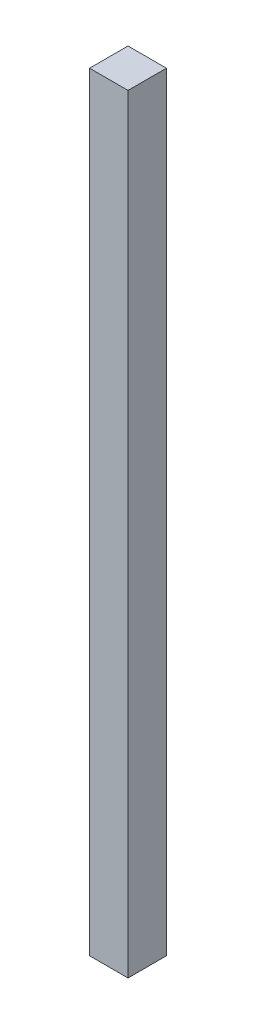
ISO-10303-21;
HEADER;
FILE_DESCRIPTION(('STEP AP214'),'2;1');
FILE_NAME('part.step','',(''),(''),'','','');
FILE_SCHEMA(('AUTOMOTIVE_DESIGN { 1 0 10303 214 1 1 1 1 }'));
ENDSEC;
DATA;
#1=APPLICATION_CONTEXT('core data for automotive mechanical design processes');
#2=APPLICATION_PROTOCOL_DEFINITION('international standard','automotive_design',2000,#1);
#3=PRODUCT_CONTEXT('',#1,'mechanical');
#4=PRODUCT('Part','Part','',(#3));
#5=PRODUCT_RELATED_PRODUCT_CATEGORY('part','',(#4));
#6=PRODUCT_DEFINITION_FORMATION('','',#4);
#7=PRODUCT_DEFINITION_CONTEXT('part definition',#1,'design');
#8=PRODUCT_DEFINITION('design','',#6,#7);
#9=PRODUCT_DEFINITION_SHAPE('','',#8);
#10=(LENGTH_UNIT() NAMED_UNIT(*) SI_UNIT(.MILLI.,.METRE.));
#11=(NAMED_UNIT(*) PLANE_ANGLE_UNIT() SI_UNIT($,.RADIAN.));
#12=(NAMED_UNIT(*) SI_UNIT($,.STERADIAN.) SOLID_ANGLE_UNIT());
#13=UNCERTAINTY_MEASURE_WITH_UNIT(LENGTH_MEASURE(1.E-05),#10,'distance_accuracy_value','');
#14=(GEOMETRIC_REPRESENTATION_CONTEXT(3) GLOBAL_UNCERTAINTY_ASSIGNED_CONTEXT((#13)) GLOBAL_UNIT_ASSIGNED_CONTEXT((#10,
#11,#12)) REPRESENTATION_CONTEXT('',''));
#15=CARTESIAN_POINT('',(0.,0.,0.));
#16=DIRECTION('',(0.,0.,1.));
#17=DIRECTION('',(1.,0.,0.));
#18=AXIS2_PLACEMENT_3D('',#15,#16,#17);
#19=CARTESIAN_POINT('',(2.5,100.,2.5));
#20=DIRECTION('',(-1.,0.,0.));
#21=DIRECTION('',(0.,0.,1.));
#22=AXIS2_PLACEMENT_3D('',#19,#20,#21);
#23=PLANE('',#22);
#24=DIRECTION('',(0.,0.,-1.));
#25=VECTOR('',#24,1.);
#26=CARTESIAN_POINT('',(2.5,0.,2.5));
#27=LINE('',#26,#25);
#28=CARTESIAN_POINT('',(2.5,0.,2.5));
#29=VERTEX_POINT('',#28);
#30=CARTESIAN_POINT('',(2.5,0.,-2.5));
#31=VERTEX_POINT('',#30);
#32=EDGE_CURVE('E101',#29,#31,#27,.T.);
#33=ORIENTED_EDGE('',*,*,#32,.T.);
#34=DIRECTION('',(0.,-1.,0.));
#35=VECTOR('',#34,1.);
#36=CARTESIAN_POINT('',(2.5,100.,-2.5));
#37=LINE('',#36,#35);
#38=CARTESIAN_POINT('',(2.5,100.,-2.5));
#39=VERTEX_POINT('',#38);
#40=EDGE_CURVE('E11',#39,#31,#37,.T.);
#41=ORIENTED_EDGE('',*,*,#40,.F.);
#42=DIRECTION('',(0.,0.,-1.));
#43=VECTOR('',#42,1.);
#44=CARTESIAN_POINT('',(2.5,100.,2.5));
#45=LINE('',#44,#43);
#46=CARTESIAN_POINT('',(2.5,100.,2.5));
#47=VERTEX_POINT('',#46);
#48=EDGE_CURVE('E89',#47,#39,#45,.T.);
#49=ORIENTED_EDGE('',*,*,#48,.F.);
#50=DIRECTION('',(0.,-1.,0.));
#51=VECTOR('',#50,1.);
#52=CARTESIAN_POINT('',(2.5,100.,2.5));
#53=LINE('',#52,#51);
#54=EDGE_CURVE('E97',#47,#29,#53,.T.);
#55=ORIENTED_EDGE('',*,*,#54,.T.);
#56=EDGE_LOOP('',(#33,#41,#49,#55));
#57=FACE_BOUND('',#56,.T.);
#58=ADVANCED_FACE('F38',(#57),#23,.F.);
#59=CARTESIAN_POINT('',(-2.5,100.,-2.5));
#60=DIRECTION('',(0.,0.,1.));
#61=DIRECTION('',(1.,0.,0.));
#62=AXIS2_PLACEMENT_3D('',#59,#60,#61);
#63=PLANE('',#62);
#64=DIRECTION('',(-1.,0.,0.));
#65=VECTOR('',#64,1.);
#66=CARTESIAN_POINT('',(-2.5,0.,-2.5));
#67=LINE('',#66,#65);
#68=CARTESIAN_POINT('',(-2.5,0.,-2.5));
#69=VERTEX_POINT('',#68);
#70=EDGE_CURVE('E93',#31,#69,#67,.T.);
#71=ORIENTED_EDGE('',*,*,#70,.T.);
#72=DIRECTION('',(0.,-1.,0.));
#73=VECTOR('',#72,1.);
#74=CARTESIAN_POINT('',(-2.5,100.,-2.5));
#75=LINE('',#74,#73);
#76=CARTESIAN_POINT('',(-2.5,100.,-2.5));
#77=VERTEX_POINT('',#76);
#78=EDGE_CURVE('E46',#77,#69,#75,.T.);
#79=ORIENTED_EDGE('',*,*,#78,.F.);
#80=DIRECTION('',(-1.,0.,0.));
#81=VECTOR('',#80,1.);
#82=CARTESIAN_POINT('',(-2.5,100.,-2.5));
#83=LINE('',#82,#81);
#84=EDGE_CURVE('E84',#39,#77,#83,.T.);
#85=ORIENTED_EDGE('',*,*,#84,.F.);
#86=ORIENTED_EDGE('',*,*,#40,.T.);
#87=EDGE_LOOP('',(#71,#79,#85,#86));
#88=FACE_BOUND('',#87,.T.);
#89=ADVANCED_FACE('F92',(#88),#63,.F.);
#90=CARTESIAN_POINT('',(-2.5,100.,2.5));
#91=DIRECTION('',(1.,0.,0.));
#92=DIRECTION('',(0.,0.,-1.));
#93=AXIS2_PLACEMENT_3D('',#90,#91,#92);
#94=PLANE('',#93);
#95=DIRECTION('',(0.,0.,1.));
#96=VECTOR('',#95,1.);
#97=CARTESIAN_POINT('',(-2.5,0.,2.5));
#98=LINE('',#97,#96);
#99=CARTESIAN_POINT('',(-2.5,0.,2.5));
#100=VERTEX_POINT('',#99);
#101=EDGE_CURVE('E71',#69,#100,#98,.T.);
#102=ORIENTED_EDGE('',*,*,#101,.T.);
#103=DIRECTION('',(0.,-1.,0.));
#104=VECTOR('',#103,1.);
#105=CARTESIAN_POINT('',(-2.5,100.,2.5));
#106=LINE('',#105,#104);
#107=CARTESIAN_POINT('',(-2.5,100.,2.5));
#108=VERTEX_POINT('',#107);
#109=EDGE_CURVE('E94',#108,#100,#106,.T.);
#110=ORIENTED_EDGE('',*,*,#109,.F.);
#111=DIRECTION('',(0.,0.,1.));
#112=VECTOR('',#111,1.);
#113=CARTESIAN_POINT('',(-2.5,100.,2.5));
#114=LINE('',#113,#112);
#115=EDGE_CURVE('E87',#77,#108,#114,.T.);
#116=ORIENTED_EDGE('',*,*,#115,.F.);
#117=ORIENTED_EDGE('',*,*,#78,.T.);
#118=EDGE_LOOP('',(#102,#110,#116,#117));
#119=FACE_BOUND('',#118,.T.);
#120=ADVANCED_FACE('F95',(#119),#94,.F.);
#121=CARTESIAN_POINT('',(-2.5,100.,2.5));
#122=DIRECTION('',(0.,0.,-1.));
#123=DIRECTION('',(-1.,0.,0.));
#124=AXIS2_PLACEMENT_3D('',#121,#122,#123);
#125=PLANE('',#124);
#126=DIRECTION('',(1.,0.,0.));
#127=VECTOR('',#126,1.);
#128=CARTESIAN_POINT('',(-2.5,0.,2.5));
#129=LINE('',#128,#127);
#130=EDGE_CURVE('E77',#100,#29,#129,.T.);
#131=ORIENTED_EDGE('',*,*,#130,.T.);
#132=ORIENTED_EDGE('',*,*,#54,.F.);
#133=DIRECTION('',(1.,0.,0.));
#134=VECTOR('',#133,1.);
#135=CARTESIAN_POINT('',(-2.5,100.,2.5));
#136=LINE('',#135,#134);
#137=EDGE_CURVE('E54',#108,#47,#136,.T.);
#138=ORIENTED_EDGE('',*,*,#137,.F.);
#139=ORIENTED_EDGE('',*,*,#109,.T.);
#140=EDGE_LOOP('',(#131,#132,#138,#139));
#141=FACE_BOUND('',#140,.T.);
#142=ADVANCED_FACE('F108',(#141),#125,.F.);
#143=CARTESIAN_POINT('',(0.,100.,0.));
#144=DIRECTION('',(0.,-1.,0.));
#145=DIRECTION('',(0.,0.,-1.));
#146=AXIS2_PLACEMENT_3D('',#143,#144,#145);
#147=PLANE('',#146);
#148=ORIENTED_EDGE('',*,*,#48,.T.);
#149=ORIENTED_EDGE('',*,*,#84,.T.);
#150=ORIENTED_EDGE('',*,*,#115,.T.);
#151=ORIENTED_EDGE('',*,*,#137,.T.);
#152=EDGE_LOOP('',(#148,#149,#150,#151));
#153=FACE_BOUND('',#152,.T.);
#154=ADVANCED_FACE('F85',(#153),#147,.F.);
#155=CARTESIAN_POINT('',(0.,0.,0.));
#156=DIRECTION('',(0.,-1.,0.));
#157=DIRECTION('',(0.,0.,-1.));
#158=AXIS2_PLACEMENT_3D('',#155,#156,#157);
#159=PLANE('',#158);
#160=ORIENTED_EDGE('',*,*,#32,.F.);
#161=ORIENTED_EDGE('',*,*,#130,.F.);
#162=ORIENTED_EDGE('',*,*,#101,.F.);
#163=ORIENTED_EDGE('',*,*,#70,.F.);
#164=EDGE_LOOP('',(#160,#161,#162,#163));
#165=FACE_BOUND('',#164,.T.);
#166=ADVANCED_FACE('F111',(#165),#159,.T.);
#167=CLOSED_SHELL('',(#58,#89,#120,#142,#154,#166));
#168=MANIFOLD_SOLID_BREP('B2',#167);
#169=ADVANCED_BREP_SHAPE_REPRESENTATION('',(#18,#168),#14);
#170=SHAPE_DEFINITION_REPRESENTATION(#9,#169);
ENDSEC;
END-ISO-10303-21;
